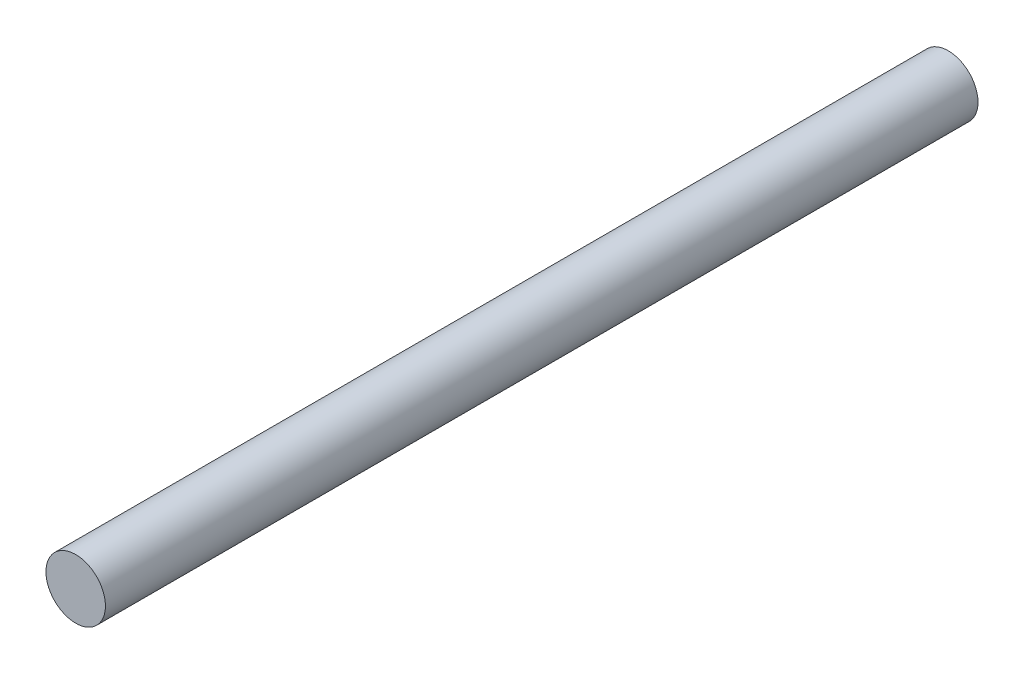
ISO-10303-21;
HEADER;
FILE_DESCRIPTION(('STEP AP214'),'2;1');
FILE_NAME('part.step','',(''),(''),'','','');
FILE_SCHEMA(('AUTOMOTIVE_DESIGN { 1 0 10303 214 1 1 1 1 }'));
ENDSEC;
DATA;
#1=APPLICATION_CONTEXT('core data for automotive mechanical design processes');
#2=APPLICATION_PROTOCOL_DEFINITION('international standard','automotive_design',2000,#1);
#3=PRODUCT_CONTEXT('',#1,'mechanical');
#4=PRODUCT('Part','Part','',(#3));
#5=PRODUCT_RELATED_PRODUCT_CATEGORY('part','',(#4));
#6=PRODUCT_DEFINITION_FORMATION('','',#4);
#7=PRODUCT_DEFINITION_CONTEXT('part definition',#1,'design');
#8=PRODUCT_DEFINITION('design','',#6,#7);
#9=PRODUCT_DEFINITION_SHAPE('','',#8);
#10=(LENGTH_UNIT() NAMED_UNIT(*) SI_UNIT(.MILLI.,.METRE.));
#11=(NAMED_UNIT(*) PLANE_ANGLE_UNIT() SI_UNIT($,.RADIAN.));
#12=(NAMED_UNIT(*) SI_UNIT($,.STERADIAN.) SOLID_ANGLE_UNIT());
#13=UNCERTAINTY_MEASURE_WITH_UNIT(LENGTH_MEASURE(1.E-05),#10,'distance_accuracy_value','');
#14=(GEOMETRIC_REPRESENTATION_CONTEXT(3) GLOBAL_UNCERTAINTY_ASSIGNED_CONTEXT((#13)) GLOBAL_UNIT_ASSIGNED_CONTEXT((#10,
#11,#12)) REPRESENTATION_CONTEXT('',''));
#15=CARTESIAN_POINT('',(0.,0.,0.));
#16=DIRECTION('',(0.,0.,1.));
#17=DIRECTION('',(1.,0.,0.));
#18=AXIS2_PLACEMENT_3D('',#15,#16,#17);
#19=CARTESIAN_POINT('',(0.,0.,44.));
#20=DIRECTION('',(0.,0.,-1.));
#21=DIRECTION('',(-1.,0.,0.));
#22=AXIS2_PLACEMENT_3D('',#19,#20,#21);
#23=CYLINDRICAL_SURFACE('',#22,1.5);
#24=CARTESIAN_POINT('',(0.,0.,44.));
#25=DIRECTION('',(0.,0.,1.));
#26=DIRECTION('',(1.,0.,0.));
#27=AXIS2_PLACEMENT_3D('',#24,#25,#26);
#28=CIRCLE('',#27,1.5);
#29=CARTESIAN_POINT('',(1.5,0.,44.));
#30=VERTEX_POINT('',#29);
#31=EDGE_CURVE('E10',#30,#30,#28,.T.);
#32=ORIENTED_EDGE('',*,*,#31,.F.);
#33=EDGE_LOOP('',(#32));
#34=FACE_BOUND('',#33,.T.);
#35=CARTESIAN_POINT('',(0.,0.,0.));
#36=DIRECTION('',(0.,0.,1.));
#37=DIRECTION('',(1.,0.,0.));
#38=AXIS2_PLACEMENT_3D('',#35,#36,#37);
#39=CIRCLE('',#38,1.5);
#40=CARTESIAN_POINT('',(1.5,0.,0.));
#41=VERTEX_POINT('',#40);
#42=EDGE_CURVE('E34',#41,#41,#39,.T.);
#43=ORIENTED_EDGE('',*,*,#42,.T.);
#44=EDGE_LOOP('',(#43));
#45=FACE_BOUND('',#44,.T.);
#46=ADVANCED_FACE('F31',(#34,#45),#23,.T.);
#47=CARTESIAN_POINT('',(0.,0.,44.));
#48=DIRECTION('',(0.,0.,1.));
#49=DIRECTION('',(1.,0.,0.));
#50=AXIS2_PLACEMENT_3D('',#47,#48,#49);
#51=PLANE('',#50);
#52=ORIENTED_EDGE('',*,*,#31,.T.);
#53=EDGE_LOOP('',(#52));
#54=FACE_BOUND('',#53,.T.);
#55=ADVANCED_FACE('F46',(#54),#51,.T.);
#56=CARTESIAN_POINT('',(0.,0.,0.));
#57=DIRECTION('',(0.,0.,1.));
#58=DIRECTION('',(1.,0.,0.));
#59=AXIS2_PLACEMENT_3D('',#56,#57,#58);
#60=PLANE('',#59);
#61=ORIENTED_EDGE('',*,*,#42,.F.);
#62=EDGE_LOOP('',(#61));
#63=FACE_BOUND('',#62,.T.);
#64=ADVANCED_FACE('F44',(#63),#60,.F.);
#65=CLOSED_SHELL('',(#46,#55,#64));
#66=MANIFOLD_SOLID_BREP('B2',#65);
#67=ADVANCED_BREP_SHAPE_REPRESENTATION('',(#18,#66),#14);
#68=SHAPE_DEFINITION_REPRESENTATION(#9,#67);
ENDSEC;
END-ISO-10303-21;
